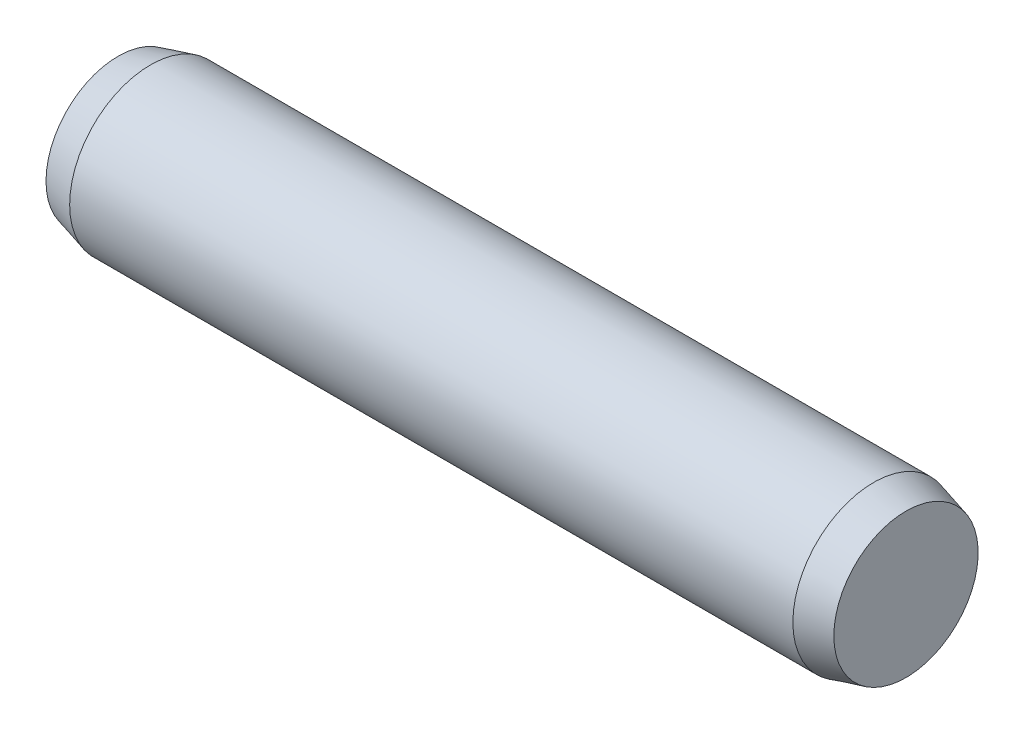
ISO-10303-21;
HEADER;
FILE_DESCRIPTION(('STEP AP214'),'2;1');
FILE_NAME('part.step','',(''),(''),'','','');
FILE_SCHEMA(('AUTOMOTIVE_DESIGN { 1 0 10303 214 1 1 1 1 }'));
ENDSEC;
DATA;
#1=APPLICATION_CONTEXT('core data for automotive mechanical design processes');
#2=APPLICATION_PROTOCOL_DEFINITION('international standard','automotive_design',2000,#1);
#3=PRODUCT_CONTEXT('',#1,'mechanical');
#4=PRODUCT('Part','Part','',(#3));
#5=PRODUCT_RELATED_PRODUCT_CATEGORY('part','',(#4));
#6=PRODUCT_DEFINITION_FORMATION('','',#4);
#7=PRODUCT_DEFINITION_CONTEXT('part definition',#1,'design');
#8=PRODUCT_DEFINITION('design','',#6,#7);
#9=PRODUCT_DEFINITION_SHAPE('','',#8);
#10=(LENGTH_UNIT() NAMED_UNIT(*) SI_UNIT(.MILLI.,.METRE.));
#11=(NAMED_UNIT(*) PLANE_ANGLE_UNIT() SI_UNIT($,.RADIAN.));
#12=(NAMED_UNIT(*) SI_UNIT($,.STERADIAN.) SOLID_ANGLE_UNIT());
#13=UNCERTAINTY_MEASURE_WITH_UNIT(LENGTH_MEASURE(1.E-05),#10,'distance_accuracy_value','');
#14=(GEOMETRIC_REPRESENTATION_CONTEXT(3) GLOBAL_UNCERTAINTY_ASSIGNED_CONTEXT((#13)) GLOBAL_UNIT_ASSIGNED_CONTEXT((#10,
#11,#12)) REPRESENTATION_CONTEXT('',''));
#15=CARTESIAN_POINT('',(0.,0.,0.));
#16=DIRECTION('',(0.,0.,1.));
#17=DIRECTION('',(1.,0.,0.));
#18=AXIS2_PLACEMENT_3D('',#15,#16,#17);
#19=CARTESIAN_POINT('',(0.,3.57128129211021,0.));
#20=DIRECTION('',(1.,0.,0.));
#21=DIRECTION('',(0.,0.,-1.));
#22=AXIS2_PLACEMENT_3D('',#19,#20,#21);
#23=PLANE('',#22);
#24=CARTESIAN_POINT('',(0.,0.,0.));
#25=DIRECTION('',(-1.,0.,0.));
#26=DIRECTION('',(0.,0.,1.));
#27=AXIS2_PLACEMENT_3D('',#24,#25,#26);
#28=CIRCLE('',#27,3.57128129211021);
#29=CARTESIAN_POINT('',(0.,0.,3.57128129211021));
#30=VERTEX_POINT('',#29);
#31=EDGE_CURVE('E10',#30,#30,#28,.T.);
#32=ORIENTED_EDGE('',*,*,#31,.T.);
#33=EDGE_LOOP('',(#32));
#34=FACE_BOUND('',#33,.T.);
#35=ADVANCED_FACE('F33',(#34),#23,.F.);
#36=CARTESIAN_POINT('',(1.6,0.,0.));
#37=DIRECTION('',(1.,0.,0.));
#38=DIRECTION('',(0.,0.,-1.));
#39=AXIS2_PLACEMENT_3D('',#36,#37,#38);
#40=CONICAL_SURFACE('',#39,4.,0.261799387799143);
#41=ORIENTED_EDGE('',*,*,#31,.F.);
#42=EDGE_LOOP('',(#41));
#43=FACE_BOUND('',#42,.T.);
#44=CARTESIAN_POINT('',(1.6,0.,0.));
#45=DIRECTION('',(-1.,0.,0.));
#46=DIRECTION('',(0.,0.,1.));
#47=AXIS2_PLACEMENT_3D('',#44,#45,#46);
#48=CIRCLE('',#47,4.);
#49=CARTESIAN_POINT('',(1.6,0.,4.));
#50=VERTEX_POINT('',#49);
#51=EDGE_CURVE('E39',#50,#50,#48,.T.);
#52=ORIENTED_EDGE('',*,*,#51,.T.);
#53=EDGE_LOOP('',(#52));
#54=FACE_BOUND('',#53,.T.);
#55=ADVANCED_FACE('F65',(#43,#54),#40,.T.);
#56=CARTESIAN_POINT('',(-6.35,0.,0.));
#57=DIRECTION('',(-1.,0.,0.));
#58=DIRECTION('',(0.,0.,1.));
#59=AXIS2_PLACEMENT_3D('',#56,#57,#58);
#60=CYLINDRICAL_SURFACE('',#59,4.);
#61=ORIENTED_EDGE('',*,*,#51,.F.);
#62=EDGE_LOOP('',(#61));
#63=FACE_BOUND('',#62,.T.);
#64=CARTESIAN_POINT('',(37.4,0.,0.));
#65=DIRECTION('',(-1.,0.,0.));
#66=DIRECTION('',(0.,0.,1.));
#67=AXIS2_PLACEMENT_3D('',#64,#65,#66);
#68=CIRCLE('',#67,4.);
#69=CARTESIAN_POINT('',(37.4,0.,4.));
#70=VERTEX_POINT('',#69);
#71=EDGE_CURVE('E43',#70,#70,#68,.T.);
#72=ORIENTED_EDGE('',*,*,#71,.T.);
#73=EDGE_LOOP('',(#72));
#74=FACE_BOUND('',#73,.T.);
#75=ADVANCED_FACE('F61',(#63,#74),#60,.T.);
#76=CARTESIAN_POINT('',(39.,0.,0.));
#77=DIRECTION('',(-1.,0.,0.));
#78=DIRECTION('',(0.,0.,1.));
#79=AXIS2_PLACEMENT_3D('',#76,#77,#78);
#80=CONICAL_SURFACE('',#79,3.5712812921102,0.26179938779915);
#81=ORIENTED_EDGE('',*,*,#71,.F.);
#82=EDGE_LOOP('',(#81));
#83=FACE_BOUND('',#82,.T.);
#84=CARTESIAN_POINT('',(39.,0.,0.));
#85=DIRECTION('',(-1.,0.,0.));
#86=DIRECTION('',(0.,0.,1.));
#87=AXIS2_PLACEMENT_3D('',#84,#85,#86);
#88=CIRCLE('',#87,3.5712812921102);
#89=CARTESIAN_POINT('',(39.,0.,3.5712812921102));
#90=VERTEX_POINT('',#89);
#91=EDGE_CURVE('E47',#90,#90,#88,.T.);
#92=ORIENTED_EDGE('',*,*,#91,.T.);
#93=EDGE_LOOP('',(#92));
#94=FACE_BOUND('',#93,.T.);
#95=ADVANCED_FACE('F53',(#83,#94),#80,.T.);
#96=CARTESIAN_POINT('',(39.,0.,0.));
#97=DIRECTION('',(-1.,0.,0.));
#98=DIRECTION('',(0.,0.,1.));
#99=AXIS2_PLACEMENT_3D('',#96,#97,#98);
#100=PLANE('',#99);
#101=ORIENTED_EDGE('',*,*,#91,.F.);
#102=EDGE_LOOP('',(#101));
#103=FACE_BOUND('',#102,.T.);
#104=ADVANCED_FACE('F55',(#103),#100,.F.);
#105=CLOSED_SHELL('',(#35,#55,#75,#95,#104));
#106=MANIFOLD_SOLID_BREP('B2',#105);
#107=ADVANCED_BREP_SHAPE_REPRESENTATION('',(#18,#106),#14);
#108=SHAPE_DEFINITION_REPRESENTATION(#9,#107);
ENDSEC;
END-ISO-10303-21;
